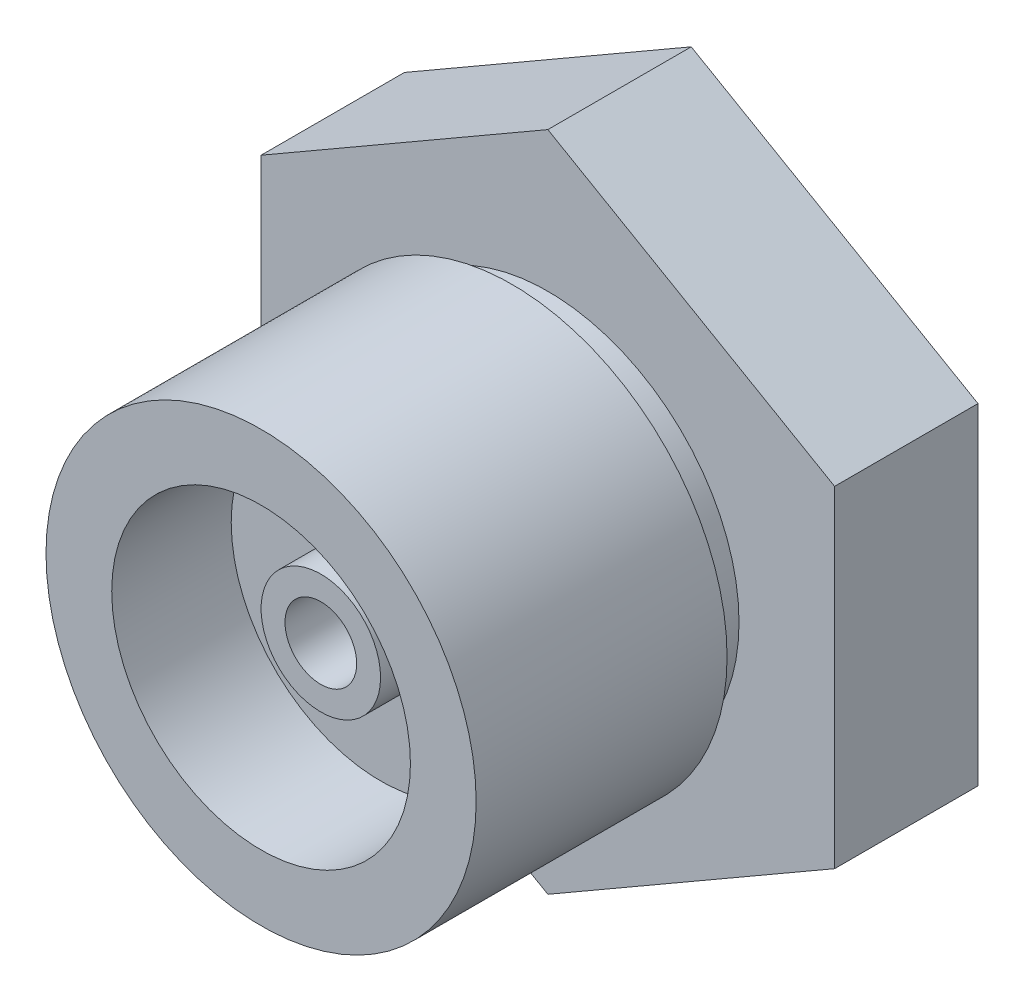
ISO-10303-21;
HEADER;
FILE_DESCRIPTION(('STEP AP214'),'2;1');
FILE_NAME('part.step','',(''),(''),'','','');
FILE_SCHEMA(('AUTOMOTIVE_DESIGN { 1 0 10303 214 1 1 1 1 }'));
ENDSEC;
DATA;
#1=APPLICATION_CONTEXT('core data for automotive mechanical design processes');
#2=APPLICATION_PROTOCOL_DEFINITION('international standard','automotive_design',2000,#1);
#3=PRODUCT_CONTEXT('',#1,'mechanical');
#4=PRODUCT('Part','Part','',(#3));
#5=PRODUCT_RELATED_PRODUCT_CATEGORY('part','',(#4));
#6=PRODUCT_DEFINITION_FORMATION('','',#4);
#7=PRODUCT_DEFINITION_CONTEXT('part definition',#1,'design');
#8=PRODUCT_DEFINITION('design','',#6,#7);
#9=PRODUCT_DEFINITION_SHAPE('','',#8);
#10=(LENGTH_UNIT() NAMED_UNIT(*) SI_UNIT(.MILLI.,.METRE.));
#11=(NAMED_UNIT(*) PLANE_ANGLE_UNIT() SI_UNIT($,.RADIAN.));
#12=(NAMED_UNIT(*) SI_UNIT($,.STERADIAN.) SOLID_ANGLE_UNIT());
#13=UNCERTAINTY_MEASURE_WITH_UNIT(LENGTH_MEASURE(1.E-05),#10,'distance_accuracy_value','');
#14=(GEOMETRIC_REPRESENTATION_CONTEXT(3) GLOBAL_UNCERTAINTY_ASSIGNED_CONTEXT((#13)) GLOBAL_UNIT_ASSIGNED_CONTEXT((#10,
#11,#12)) REPRESENTATION_CONTEXT('',''));
#15=CARTESIAN_POINT('',(0.,0.,0.));
#16=DIRECTION('',(0.,0.,1.));
#17=DIRECTION('',(1.,0.,0.));
#18=AXIS2_PLACEMENT_3D('',#15,#16,#17);
#19=CARTESIAN_POINT('',(0.,0.,26.));
#20=DIRECTION('',(0.,0.,1.));
#21=DIRECTION('',(1.,0.,0.));
#22=AXIS2_PLACEMENT_3D('',#19,#20,#21);
#23=CYLINDRICAL_SURFACE('',#22,5.);
#24=CARTESIAN_POINT('',(0.,0.,26.));
#25=DIRECTION('',(0.,0.,1.));
#26=DIRECTION('',(1.,0.,0.));
#27=AXIS2_PLACEMENT_3D('',#24,#25,#26);
#28=CIRCLE('',#27,5.);
#29=CARTESIAN_POINT('',(5.,0.,26.));
#30=VERTEX_POINT('',#29);
#31=EDGE_CURVE('E131',#30,#30,#28,.T.);
#32=ORIENTED_EDGE('',*,*,#31,.T.);
#33=EDGE_LOOP('',(#32));
#34=FACE_BOUND('',#33,.T.);
#35=CARTESIAN_POINT('',(0.,0.,31.));
#36=DIRECTION('',(0.,0.,1.));
#37=DIRECTION('',(1.,0.,0.));
#38=AXIS2_PLACEMENT_3D('',#35,#36,#37);
#39=CIRCLE('',#38,5.);
#40=CARTESIAN_POINT('',(5.,0.,31.));
#41=VERTEX_POINT('',#40);
#42=EDGE_CURVE('E124',#41,#41,#39,.T.);
#43=ORIENTED_EDGE('',*,*,#42,.F.);
#44=EDGE_LOOP('',(#43));
#45=FACE_BOUND('',#44,.T.);
#46=ADVANCED_FACE('F41',(#34,#45),#23,.T.);
#47=CARTESIAN_POINT('',(0.,24.,12.));
#48=DIRECTION('',(0.,0.,1.));
#49=DIRECTION('',(1.,0.,0.));
#50=AXIS2_PLACEMENT_3D('',#47,#48,#49);
#51=PLANE('',#50);
#52=CARTESIAN_POINT('',(0.,0.,12.));
#53=DIRECTION('',(0.,0.,-1.));
#54=DIRECTION('',(-1.,0.,0.));
#55=AXIS2_PLACEMENT_3D('',#52,#53,#54);
#56=CIRCLE('',#55,16.);
#57=CARTESIAN_POINT('',(-16.,0.,12.));
#58=VERTEX_POINT('',#57);
#59=EDGE_CURVE('E11',#58,#58,#56,.T.);
#60=ORIENTED_EDGE('',*,*,#59,.T.);
#61=EDGE_LOOP('',(#60));
#62=FACE_BOUND('',#61,.T.);
#63=DIRECTION('',(0.866025403784439,-0.5,0.));
#64=VECTOR('',#63,1.);
#65=CARTESIAN_POINT('',(0.,27.712812921102,12.));
#66=LINE('',#65,#64);
#67=CARTESIAN_POINT('',(0.,27.712812921102,12.));
#68=VERTEX_POINT('',#67);
#69=CARTESIAN_POINT('',(24.,13.856406460551,12.));
#70=VERTEX_POINT('',#69);
#71=EDGE_CURVE('E88',#68,#70,#66,.T.);
#72=ORIENTED_EDGE('',*,*,#71,.F.);
#73=DIRECTION('',(0.866025403784439,0.5,0.));
#74=VECTOR('',#73,1.);
#75=CARTESIAN_POINT('',(-24.,13.856406460551,12.));
#76=LINE('',#75,#74);
#77=CARTESIAN_POINT('',(-24.,13.856406460551,12.));
#78=VERTEX_POINT('',#77);
#79=EDGE_CURVE('E125',#78,#68,#76,.T.);
#80=ORIENTED_EDGE('',*,*,#79,.F.);
#81=DIRECTION('',(0.,1.,0.));
#82=VECTOR('',#81,1.);
#83=CARTESIAN_POINT('',(-24.,-13.856406460551,12.));
#84=LINE('',#83,#82);
#85=CARTESIAN_POINT('',(-24.,-13.856406460551,12.));
#86=VERTEX_POINT('',#85);
#87=EDGE_CURVE('E358',#86,#78,#84,.T.);
#88=ORIENTED_EDGE('',*,*,#87,.F.);
#89=DIRECTION('',(-0.866025403784439,0.5,0.));
#90=VECTOR('',#89,1.);
#91=CARTESIAN_POINT('',(0.,-27.712812921102,12.));
#92=LINE('',#91,#90);
#93=CARTESIAN_POINT('',(0.,-27.712812921102,12.));
#94=VERTEX_POINT('',#93);
#95=EDGE_CURVE('E350',#94,#86,#92,.T.);
#96=ORIENTED_EDGE('',*,*,#95,.F.);
#97=DIRECTION('',(-0.866025403784439,-0.5,0.));
#98=VECTOR('',#97,1.);
#99=CARTESIAN_POINT('',(24.,-13.856406460551,12.));
#100=LINE('',#99,#98);
#101=CARTESIAN_POINT('',(24.,-13.856406460551,12.));
#102=VERTEX_POINT('',#101);
#103=EDGE_CURVE('E349',#102,#94,#100,.T.);
#104=ORIENTED_EDGE('',*,*,#103,.F.);
#105=DIRECTION('',(0.,-1.,0.));
#106=VECTOR('',#105,1.);
#107=CARTESIAN_POINT('',(24.,13.856406460551,12.));
#108=LINE('',#107,#106);
#109=EDGE_CURVE('E83',#70,#102,#108,.T.);
#110=ORIENTED_EDGE('',*,*,#109,.F.);
#111=EDGE_LOOP('',(#72,#80,#88,#96,#104,#110));
#112=FACE_BOUND('',#111,.T.);
#113=ADVANCED_FACE('F164',(#62,#112),#51,.T.);
#114=CARTESIAN_POINT('',(0.,0.,0.));
#115=DIRECTION('',(0.,0.,-1.));
#116=DIRECTION('',(-1.,0.,0.));
#117=AXIS2_PLACEMENT_3D('',#114,#115,#116);
#118=CYLINDRICAL_SURFACE('',#117,16.);
#119=CARTESIAN_POINT('',(0.,0.,15.));
#120=DIRECTION('',(0.,0.,-1.));
#121=DIRECTION('',(-1.,0.,0.));
#122=AXIS2_PLACEMENT_3D('',#119,#120,#121);
#123=CIRCLE('',#122,16.);
#124=CARTESIAN_POINT('',(-16.,0.,15.));
#125=VERTEX_POINT('',#124);
#126=EDGE_CURVE('E51',#125,#125,#123,.T.);
#127=ORIENTED_EDGE('',*,*,#126,.T.);
#128=EDGE_LOOP('',(#127));
#129=FACE_BOUND('',#128,.T.);
#130=ORIENTED_EDGE('',*,*,#59,.F.);
#131=EDGE_LOOP('',(#130));
#132=FACE_BOUND('',#131,.T.);
#133=ADVANCED_FACE('F149',(#129,#132),#118,.T.);
#134=CARTESIAN_POINT('',(0.,16.,15.));
#135=DIRECTION('',(0.,0.,-1.));
#136=DIRECTION('',(-1.,0.,0.));
#137=AXIS2_PLACEMENT_3D('',#134,#135,#136);
#138=PLANE('',#137);
#139=CARTESIAN_POINT('',(0.,0.,15.));
#140=DIRECTION('',(0.,0.,-1.));
#141=DIRECTION('',(-1.,0.,0.));
#142=AXIS2_PLACEMENT_3D('',#139,#140,#141);
#143=CIRCLE('',#142,18.);
#144=CARTESIAN_POINT('',(-18.,0.,15.));
#145=VERTEX_POINT('',#144);
#146=EDGE_CURVE('E143',#145,#145,#143,.T.);
#147=ORIENTED_EDGE('',*,*,#146,.T.);
#148=EDGE_LOOP('',(#147));
#149=FACE_BOUND('',#148,.T.);
#150=ORIENTED_EDGE('',*,*,#126,.F.);
#151=EDGE_LOOP('',(#150));
#152=FACE_BOUND('',#151,.T.);
#153=ADVANCED_FACE('F152',(#149,#152),#138,.T.);
#154=CARTESIAN_POINT('',(0.,0.,0.));
#155=DIRECTION('',(0.,0.,-1.));
#156=DIRECTION('',(-1.,0.,0.));
#157=AXIS2_PLACEMENT_3D('',#154,#155,#156);
#158=CYLINDRICAL_SURFACE('',#157,18.);
#159=CARTESIAN_POINT('',(0.,0.,36.));
#160=DIRECTION('',(0.,0.,-1.));
#161=DIRECTION('',(-1.,0.,0.));
#162=AXIS2_PLACEMENT_3D('',#159,#160,#161);
#163=CIRCLE('',#162,18.);
#164=CARTESIAN_POINT('',(-18.,0.,36.));
#165=VERTEX_POINT('',#164);
#166=EDGE_CURVE('E138',#165,#165,#163,.T.);
#167=ORIENTED_EDGE('',*,*,#166,.T.);
#168=EDGE_LOOP('',(#167));
#169=FACE_BOUND('',#168,.T.);
#170=ORIENTED_EDGE('',*,*,#146,.F.);
#171=EDGE_LOOP('',(#170));
#172=FACE_BOUND('',#171,.T.);
#173=ADVANCED_FACE('F154',(#169,#172),#158,.T.);
#174=CARTESIAN_POINT('',(0.,18.,36.));
#175=DIRECTION('',(0.,0.,1.));
#176=DIRECTION('',(1.,0.,0.));
#177=AXIS2_PLACEMENT_3D('',#174,#175,#176);
#178=PLANE('',#177);
#179=CARTESIAN_POINT('',(0.,0.,36.));
#180=DIRECTION('',(0.,0.,1.));
#181=DIRECTION('',(1.,0.,0.));
#182=AXIS2_PLACEMENT_3D('',#179,#180,#181);
#183=CIRCLE('',#182,12.5);
#184=CARTESIAN_POINT('',(12.5,0.,36.));
#185=VERTEX_POINT('',#184);
#186=EDGE_CURVE('E134',#185,#185,#183,.T.);
#187=ORIENTED_EDGE('',*,*,#186,.F.);
#188=EDGE_LOOP('',(#187));
#189=FACE_BOUND('',#188,.T.);
#190=ORIENTED_EDGE('',*,*,#166,.F.);
#191=EDGE_LOOP('',(#190));
#192=FACE_BOUND('',#191,.T.);
#193=ADVANCED_FACE('F161',(#189,#192),#178,.T.);
#194=CARTESIAN_POINT('',(0.,0.,26.));
#195=DIRECTION('',(0.,0.,1.));
#196=DIRECTION('',(1.,0.,0.));
#197=AXIS2_PLACEMENT_3D('',#194,#195,#196);
#198=CYLINDRICAL_SURFACE('',#197,12.5);
#199=CARTESIAN_POINT('',(0.,0.,26.));
#200=DIRECTION('',(0.,0.,1.));
#201=DIRECTION('',(1.,0.,0.));
#202=AXIS2_PLACEMENT_3D('',#199,#200,#201);
#203=CIRCLE('',#202,12.5);
#204=CARTESIAN_POINT('',(12.5,0.,26.));
#205=VERTEX_POINT('',#204);
#206=EDGE_CURVE('E135',#205,#205,#203,.T.);
#207=ORIENTED_EDGE('',*,*,#206,.F.);
#208=EDGE_LOOP('',(#207));
#209=FACE_BOUND('',#208,.T.);
#210=ORIENTED_EDGE('',*,*,#186,.T.);
#211=EDGE_LOOP('',(#210));
#212=FACE_BOUND('',#211,.T.);
#213=ADVANCED_FACE('F182',(#209,#212),#198,.F.);
#214=CARTESIAN_POINT('',(0.,0.,26.));
#215=DIRECTION('',(0.,0.,1.));
#216=DIRECTION('',(1.,0.,0.));
#217=AXIS2_PLACEMENT_3D('',#214,#215,#216);
#218=PLANE('',#217);
#219=ORIENTED_EDGE('',*,*,#31,.F.);
#220=EDGE_LOOP('',(#219));
#221=FACE_BOUND('',#220,.T.);
#222=ORIENTED_EDGE('',*,*,#206,.T.);
#223=EDGE_LOOP('',(#222));
#224=FACE_BOUND('',#223,.T.);
#225=ADVANCED_FACE('F178',(#221,#224),#218,.T.);
#226=CARTESIAN_POINT('',(0.,0.,31.));
#227=DIRECTION('',(0.,0.,1.));
#228=DIRECTION('',(1.,0.,0.));
#229=AXIS2_PLACEMENT_3D('',#226,#227,#228);
#230=PLANE('',#229);
#231=ORIENTED_EDGE('',*,*,#42,.T.);
#232=EDGE_LOOP('',(#231));
#233=FACE_BOUND('',#232,.T.);
#234=CARTESIAN_POINT('',(0.,0.,31.));
#235=DIRECTION('',(0.,0.,1.));
#236=DIRECTION('',(1.,0.,0.));
#237=AXIS2_PLACEMENT_3D('',#234,#235,#236);
#238=CIRCLE('',#237,3.);
#239=CARTESIAN_POINT('',(3.,0.,31.));
#240=VERTEX_POINT('',#239);
#241=EDGE_CURVE('E45',#240,#240,#238,.F.);
#242=ORIENTED_EDGE('',*,*,#241,.T.);
#243=EDGE_LOOP('',(#242));
#244=FACE_BOUND('',#243,.T.);
#245=ADVANCED_FACE('F181',(#233,#244),#230,.T.);
#246=CARTESIAN_POINT('',(0.,0.,26.));
#247=DIRECTION('',(0.,0.,1.));
#248=DIRECTION('',(1.,0.,0.));
#249=AXIS2_PLACEMENT_3D('',#246,#247,#248);
#250=PLANE('',#249);
#251=CARTESIAN_POINT('',(0.,0.,26.));
#252=DIRECTION('',(0.,0.,1.));
#253=DIRECTION('',(1.,0.,0.));
#254=AXIS2_PLACEMENT_3D('',#251,#252,#253);
#255=CIRCLE('',#254,3.);
#256=CARTESIAN_POINT('',(3.,0.,26.));
#257=VERTEX_POINT('',#256);
#258=EDGE_CURVE('E128',#257,#257,#255,.T.);
#259=ORIENTED_EDGE('',*,*,#258,.T.);
#260=EDGE_LOOP('',(#259));
#261=FACE_BOUND('',#260,.T.);
#262=ADVANCED_FACE('F215',(#261),#250,.T.);
#263=CARTESIAN_POINT('',(0.,0.,26.));
#264=DIRECTION('',(0.,0.,1.));
#265=DIRECTION('',(1.,0.,0.));
#266=AXIS2_PLACEMENT_3D('',#263,#264,#265);
#267=CYLINDRICAL_SURFACE('',#266,3.);
#268=ORIENTED_EDGE('',*,*,#258,.F.);
#269=EDGE_LOOP('',(#268));
#270=FACE_BOUND('',#269,.T.);
#271=ORIENTED_EDGE('',*,*,#241,.F.);
#272=EDGE_LOOP('',(#271));
#273=FACE_BOUND('',#272,.T.);
#274=ADVANCED_FACE('F176',(#270,#273),#267,.F.);
#275=CARTESIAN_POINT('',(0.,27.712812921102,85.3212111192935));
#276=DIRECTION('',(0.5,0.866025403784439,0.));
#277=DIRECTION('',(-0.866025403784439,0.5,0.));
#278=AXIS2_PLACEMENT_3D('',#275,#276,#277);
#279=PLANE('',#278);
#280=ORIENTED_EDGE('',*,*,#71,.T.);
#281=DIRECTION('',(0.,0.,-1.));
#282=VECTOR('',#281,1.);
#283=CARTESIAN_POINT('',(24.,13.856406460551,85.3212111192935));
#284=LINE('',#283,#282);
#285=CARTESIAN_POINT('',(24.,13.856406460551,0.));
#286=VERTEX_POINT('',#285);
#287=EDGE_CURVE('E106',#70,#286,#284,.T.);
#288=ORIENTED_EDGE('',*,*,#287,.T.);
#289=DIRECTION('',(0.866025403784439,-0.5,0.));
#290=VECTOR('',#289,1.);
#291=CARTESIAN_POINT('',(0.,27.712812921102,0.));
#292=LINE('',#291,#290);
#293=CARTESIAN_POINT('',(0.,27.712812921102,0.));
#294=VERTEX_POINT('',#293);
#295=EDGE_CURVE('E59',#294,#286,#292,.T.);
#296=ORIENTED_EDGE('',*,*,#295,.F.);
#297=DIRECTION('',(0.,0.,-1.));
#298=VECTOR('',#297,1.);
#299=CARTESIAN_POINT('',(0.,27.712812921102,85.3212111192935));
#300=LINE('',#299,#298);
#301=EDGE_CURVE('E122',#68,#294,#300,.T.);
#302=ORIENTED_EDGE('',*,*,#301,.F.);
#303=EDGE_LOOP('',(#280,#288,#296,#302));
#304=FACE_BOUND('',#303,.T.);
#305=ADVANCED_FACE('F114',(#304),#279,.T.);
#306=CARTESIAN_POINT('',(24.,13.856406460551,85.3212111192935));
#307=DIRECTION('',(1.,0.,0.));
#308=DIRECTION('',(0.,1.,0.));
#309=AXIS2_PLACEMENT_3D('',#306,#307,#308);
#310=PLANE('',#309);
#311=ORIENTED_EDGE('',*,*,#109,.T.);
#312=DIRECTION('',(0.,0.,-1.));
#313=VECTOR('',#312,1.);
#314=CARTESIAN_POINT('',(24.,-13.856406460551,85.3212111192935));
#315=LINE('',#314,#313);
#316=CARTESIAN_POINT('',(24.,-13.856406460551,0.));
#317=VERTEX_POINT('',#316);
#318=EDGE_CURVE('E107',#102,#317,#315,.T.);
#319=ORIENTED_EDGE('',*,*,#318,.T.);
#320=DIRECTION('',(0.,-1.,0.));
#321=VECTOR('',#320,1.);
#322=CARTESIAN_POINT('',(24.,13.856406460551,0.));
#323=LINE('',#322,#321);
#324=EDGE_CURVE('E104',#286,#317,#323,.T.);
#325=ORIENTED_EDGE('',*,*,#324,.F.);
#326=ORIENTED_EDGE('',*,*,#287,.F.);
#327=EDGE_LOOP('',(#311,#319,#325,#326));
#328=FACE_BOUND('',#327,.T.);
#329=ADVANCED_FACE('F105',(#328),#310,.T.);
#330=CARTESIAN_POINT('',(24.,-13.856406460551,85.3212111192935));
#331=DIRECTION('',(0.5,-0.866025403784439,0.));
#332=DIRECTION('',(0.866025403784439,0.5,0.));
#333=AXIS2_PLACEMENT_3D('',#330,#331,#332);
#334=PLANE('',#333);
#335=ORIENTED_EDGE('',*,*,#103,.T.);
#336=DIRECTION('',(0.,0.,-1.));
#337=VECTOR('',#336,1.);
#338=CARTESIAN_POINT('',(0.,-27.712812921102,85.3212111192935));
#339=LINE('',#338,#337);
#340=CARTESIAN_POINT('',(0.,-27.712812921102,0.));
#341=VERTEX_POINT('',#340);
#342=EDGE_CURVE('E352',#94,#341,#339,.T.);
#343=ORIENTED_EDGE('',*,*,#342,.T.);
#344=DIRECTION('',(-0.866025403784439,-0.5,0.));
#345=VECTOR('',#344,1.);
#346=CARTESIAN_POINT('',(24.,-13.856406460551,0.));
#347=LINE('',#346,#345);
#348=EDGE_CURVE('E101',#317,#341,#347,.T.);
#349=ORIENTED_EDGE('',*,*,#348,.F.);
#350=ORIENTED_EDGE('',*,*,#318,.F.);
#351=EDGE_LOOP('',(#335,#343,#349,#350));
#352=FACE_BOUND('',#351,.T.);
#353=ADVANCED_FACE('F241',(#352),#334,.T.);
#354=CARTESIAN_POINT('',(0.,-27.712812921102,85.3212111192935));
#355=DIRECTION('',(-0.5,-0.866025403784439,0.));
#356=DIRECTION('',(0.866025403784439,-0.5,0.));
#357=AXIS2_PLACEMENT_3D('',#354,#355,#356);
#358=PLANE('',#357);
#359=ORIENTED_EDGE('',*,*,#95,.T.);
#360=DIRECTION('',(0.,0.,-1.));
#361=VECTOR('',#360,1.);
#362=CARTESIAN_POINT('',(-24.,-13.856406460551,85.3212111192935));
#363=LINE('',#362,#361);
#364=CARTESIAN_POINT('',(-24.,-13.856406460551,0.));
#365=VERTEX_POINT('',#364);
#366=EDGE_CURVE('E359',#86,#365,#363,.T.);
#367=ORIENTED_EDGE('',*,*,#366,.T.);
#368=DIRECTION('',(-0.866025403784439,0.5,0.));
#369=VECTOR('',#368,1.);
#370=CARTESIAN_POINT('',(0.,-27.712812921102,0.));
#371=LINE('',#370,#369);
#372=EDGE_CURVE('E363',#341,#365,#371,.T.);
#373=ORIENTED_EDGE('',*,*,#372,.F.);
#374=ORIENTED_EDGE('',*,*,#342,.F.);
#375=EDGE_LOOP('',(#359,#367,#373,#374));
#376=FACE_BOUND('',#375,.T.);
#377=ADVANCED_FACE('F248',(#376),#358,.T.);
#378=CARTESIAN_POINT('',(-24.,-13.856406460551,85.3212111192935));
#379=DIRECTION('',(-1.,0.,0.));
#380=DIRECTION('',(0.,-1.,0.));
#381=AXIS2_PLACEMENT_3D('',#378,#379,#380);
#382=PLANE('',#381);
#383=ORIENTED_EDGE('',*,*,#87,.T.);
#384=DIRECTION('',(0.,0.,-1.));
#385=VECTOR('',#384,1.);
#386=CARTESIAN_POINT('',(-24.,13.856406460551,85.3212111192935));
#387=LINE('',#386,#385);
#388=CARTESIAN_POINT('',(-24.,13.856406460551,0.));
#389=VERTEX_POINT('',#388);
#390=EDGE_CURVE('E344',#78,#389,#387,.T.);
#391=ORIENTED_EDGE('',*,*,#390,.T.);
#392=DIRECTION('',(0.,1.,0.));
#393=VECTOR('',#392,1.);
#394=CARTESIAN_POINT('',(-24.,-13.856406460551,0.));
#395=LINE('',#394,#393);
#396=EDGE_CURVE('E117',#365,#389,#395,.T.);
#397=ORIENTED_EDGE('',*,*,#396,.F.);
#398=ORIENTED_EDGE('',*,*,#366,.F.);
#399=EDGE_LOOP('',(#383,#391,#397,#398));
#400=FACE_BOUND('',#399,.T.);
#401=ADVANCED_FACE('F255',(#400),#382,.T.);
#402=CARTESIAN_POINT('',(-24.,13.856406460551,85.3212111192935));
#403=DIRECTION('',(-0.5,0.866025403784439,0.));
#404=DIRECTION('',(-0.866025403784439,-0.5,0.));
#405=AXIS2_PLACEMENT_3D('',#402,#403,#404);
#406=PLANE('',#405);
#407=ORIENTED_EDGE('',*,*,#79,.T.);
#408=ORIENTED_EDGE('',*,*,#301,.T.);
#409=DIRECTION('',(0.866025403784439,0.5,0.));
#410=VECTOR('',#409,1.);
#411=CARTESIAN_POINT('',(-24.,13.856406460551,0.));
#412=LINE('',#411,#410);
#413=EDGE_CURVE('E111',#389,#294,#412,.T.);
#414=ORIENTED_EDGE('',*,*,#413,.F.);
#415=ORIENTED_EDGE('',*,*,#390,.F.);
#416=EDGE_LOOP('',(#407,#408,#414,#415));
#417=FACE_BOUND('',#416,.T.);
#418=ADVANCED_FACE('F263',(#417),#406,.T.);
#419=CARTESIAN_POINT('',(0.,0.,0.));
#420=DIRECTION('',(0.,0.,-1.));
#421=DIRECTION('',(-1.,0.,0.));
#422=AXIS2_PLACEMENT_3D('',#419,#420,#421);
#423=PLANE('',#422);
#424=ORIENTED_EDGE('',*,*,#348,.T.);
#425=ORIENTED_EDGE('',*,*,#372,.T.);
#426=ORIENTED_EDGE('',*,*,#396,.T.);
#427=ORIENTED_EDGE('',*,*,#413,.T.);
#428=ORIENTED_EDGE('',*,*,#295,.T.);
#429=ORIENTED_EDGE('',*,*,#324,.T.);
#430=EDGE_LOOP('',(#424,#425,#426,#427,#428,#429));
#431=FACE_BOUND('',#430,.T.);
#432=ADVANCED_FACE('F43',(#431),#423,.T.);
#433=CLOSED_SHELL('',(#46,#113,#133,#153,#173,#193,#213,#225,#245,#262,#274,#305,#329,#353,#377,
#401,#418,#432));
#434=MANIFOLD_SOLID_BREP('B2',#433);
#435=ADVANCED_BREP_SHAPE_REPRESENTATION('',(#18,#434),#14);
#436=SHAPE_DEFINITION_REPRESENTATION(#9,#435);
ENDSEC;
END-ISO-10303-21;
